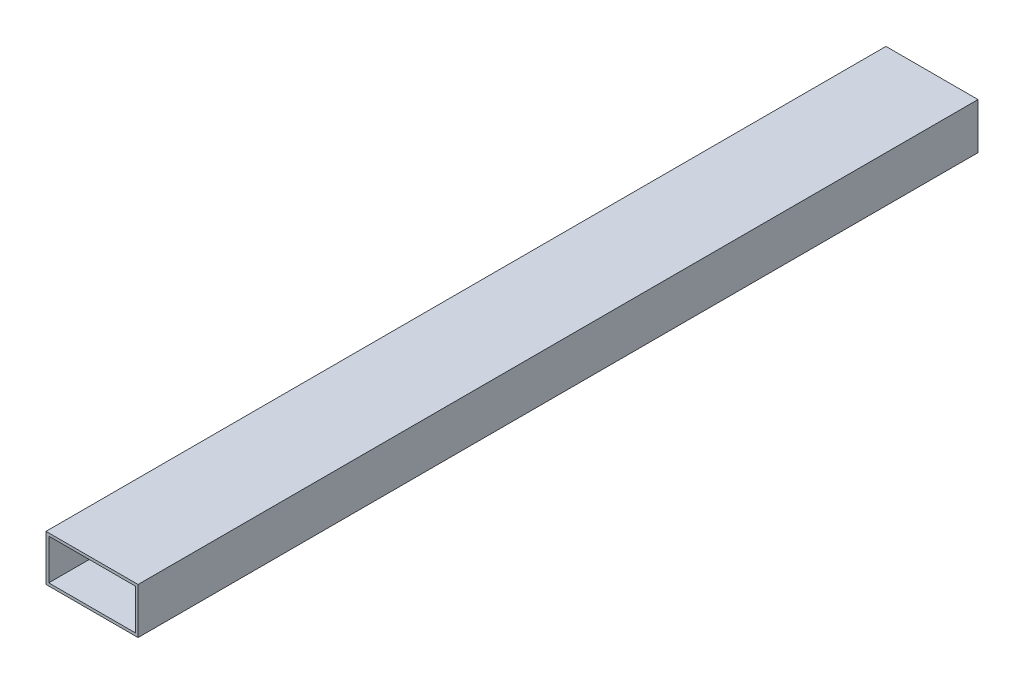
ISO-10303-21;
HEADER;
FILE_DESCRIPTION(('STEP AP214'),'2;1');
FILE_NAME('part.step','',(''),(''),'','','');
FILE_SCHEMA(('AUTOMOTIVE_DESIGN { 1 0 10303 214 1 1 1 1 }'));
ENDSEC;
DATA;
#1=APPLICATION_CONTEXT('core data for automotive mechanical design processes');
#2=APPLICATION_PROTOCOL_DEFINITION('international standard','automotive_design',2000,#1);
#3=PRODUCT_CONTEXT('',#1,'mechanical');
#4=PRODUCT('Part','Part','',(#3));
#5=PRODUCT_RELATED_PRODUCT_CATEGORY('part','',(#4));
#6=PRODUCT_DEFINITION_FORMATION('','',#4);
#7=PRODUCT_DEFINITION_CONTEXT('part definition',#1,'design');
#8=PRODUCT_DEFINITION('design','',#6,#7);
#9=PRODUCT_DEFINITION_SHAPE('','',#8);
#10=(LENGTH_UNIT() NAMED_UNIT(*) SI_UNIT(.MILLI.,.METRE.));
#11=(NAMED_UNIT(*) PLANE_ANGLE_UNIT() SI_UNIT($,.RADIAN.));
#12=(NAMED_UNIT(*) SI_UNIT($,.STERADIAN.) SOLID_ANGLE_UNIT());
#13=UNCERTAINTY_MEASURE_WITH_UNIT(LENGTH_MEASURE(1.E-05),#10,'distance_accuracy_value','');
#14=(GEOMETRIC_REPRESENTATION_CONTEXT(3) GLOBAL_UNCERTAINTY_ASSIGNED_CONTEXT((#13)) GLOBAL_UNIT_ASSIGNED_CONTEXT((#10,
#11,#12)) REPRESENTATION_CONTEXT('',''));
#15=CARTESIAN_POINT('',(0.,0.,0.));
#16=DIRECTION('',(0.,0.,1.));
#17=DIRECTION('',(1.,0.,0.));
#18=AXIS2_PLACEMENT_3D('',#15,#16,#17);
#19=CARTESIAN_POINT('',(0.,0.,463.55));
#20=DIRECTION('',(0.,0.,1.));
#21=DIRECTION('',(1.,0.,0.));
#22=AXIS2_PLACEMENT_3D('',#19,#20,#21);
#23=PLANE('',#22);
#24=DIRECTION('',(0.,1.,0.));
#25=VECTOR('',#24,1.);
#26=CARTESIAN_POINT('',(0.,0.,463.55));
#27=LINE('',#26,#25);
#28=CARTESIAN_POINT('',(0.,0.,463.55));
#29=VERTEX_POINT('',#28);
#30=CARTESIAN_POINT('',(0.,25.4,463.55));
#31=VERTEX_POINT('',#30);
#32=EDGE_CURVE('E177',#29,#31,#27,.T.);
#33=ORIENTED_EDGE('',*,*,#32,.T.);
#34=DIRECTION('',(-1.,0.,0.));
#35=VECTOR('',#34,1.);
#36=CARTESIAN_POINT('',(0.,25.4,463.55));
#37=LINE('',#36,#35);
#38=CARTESIAN_POINT('',(-50.8,25.4,463.55));
#39=VERTEX_POINT('',#38);
#40=EDGE_CURVE('E181',#31,#39,#37,.T.);
#41=ORIENTED_EDGE('',*,*,#40,.T.);
#42=DIRECTION('',(0.,-1.,0.));
#43=VECTOR('',#42,1.);
#44=CARTESIAN_POINT('',(-50.8,0.,463.55));
#45=LINE('',#44,#43);
#46=CARTESIAN_POINT('',(-50.8,0.,463.55));
#47=VERTEX_POINT('',#46);
#48=EDGE_CURVE('E185',#39,#47,#45,.T.);
#49=ORIENTED_EDGE('',*,*,#48,.T.);
#50=DIRECTION('',(1.,0.,0.));
#51=VECTOR('',#50,1.);
#52=CARTESIAN_POINT('',(0.,0.,463.55));
#53=LINE('',#52,#51);
#54=EDGE_CURVE('E188',#47,#29,#53,.T.);
#55=ORIENTED_EDGE('',*,*,#54,.T.);
#56=EDGE_LOOP('',(#33,#41,#49,#55));
#57=FACE_BOUND('',#56,.T.);
#58=DIRECTION('',(-1.,0.,0.));
#59=VECTOR('',#58,1.);
#60=CARTESIAN_POINT('',(0.,23.876,463.55));
#61=LINE('',#60,#59);
#62=CARTESIAN_POINT('',(-1.524,23.876,463.55));
#63=VERTEX_POINT('',#62);
#64=CARTESIAN_POINT('',(-49.276,23.876,463.55));
#65=VERTEX_POINT('',#64);
#66=EDGE_CURVE('E138',#63,#65,#61,.T.);
#67=ORIENTED_EDGE('',*,*,#66,.F.);
#68=DIRECTION('',(0.,1.,0.));
#69=VECTOR('',#68,1.);
#70=CARTESIAN_POINT('',(-1.524,0.,463.55));
#71=LINE('',#70,#69);
#72=CARTESIAN_POINT('',(-1.524,1.524,463.55));
#73=VERTEX_POINT('',#72);
#74=EDGE_CURVE('E129',#73,#63,#71,.T.);
#75=ORIENTED_EDGE('',*,*,#74,.F.);
#76=DIRECTION('',(1.,0.,0.));
#77=VECTOR('',#76,1.);
#78=CARTESIAN_POINT('',(0.,1.524,463.55));
#79=LINE('',#78,#77);
#80=CARTESIAN_POINT('',(-49.276,1.524,463.55));
#81=VERTEX_POINT('',#80);
#82=EDGE_CURVE('E155',#81,#73,#79,.T.);
#83=ORIENTED_EDGE('',*,*,#82,.F.);
#84=DIRECTION('',(0.,-1.,0.));
#85=VECTOR('',#84,1.);
#86=CARTESIAN_POINT('',(-49.276,0.,463.55));
#87=LINE('',#86,#85);
#88=EDGE_CURVE('E151',#65,#81,#87,.T.);
#89=ORIENTED_EDGE('',*,*,#88,.F.);
#90=EDGE_LOOP('',(#67,#75,#83,#89));
#91=FACE_BOUND('',#90,.T.);
#92=ADVANCED_FACE('F63',(#57,#91),#23,.T.);
#93=CARTESIAN_POINT('',(0.,0.,0.));
#94=DIRECTION('',(0.,0.,1.));
#95=DIRECTION('',(1.,0.,0.));
#96=AXIS2_PLACEMENT_3D('',#93,#94,#95);
#97=PLANE('',#96);
#98=DIRECTION('',(0.,1.,0.));
#99=VECTOR('',#98,1.);
#100=CARTESIAN_POINT('',(0.,0.,0.));
#101=LINE('',#100,#99);
#102=CARTESIAN_POINT('',(0.,0.,0.));
#103=VERTEX_POINT('',#102);
#104=CARTESIAN_POINT('',(0.,25.4,0.));
#105=VERTEX_POINT('',#104);
#106=EDGE_CURVE('E147',#103,#105,#101,.T.);
#107=ORIENTED_EDGE('',*,*,#106,.F.);
#108=DIRECTION('',(1.,0.,0.));
#109=VECTOR('',#108,1.);
#110=CARTESIAN_POINT('',(0.,0.,0.));
#111=LINE('',#110,#109);
#112=CARTESIAN_POINT('',(-50.8,0.,0.));
#113=VERTEX_POINT('',#112);
#114=EDGE_CURVE('E182',#113,#103,#111,.T.);
#115=ORIENTED_EDGE('',*,*,#114,.F.);
#116=DIRECTION('',(0.,-1.,0.));
#117=VECTOR('',#116,1.);
#118=CARTESIAN_POINT('',(-50.8,0.,0.));
#119=LINE('',#118,#117);
#120=CARTESIAN_POINT('',(-50.8,25.4,0.));
#121=VERTEX_POINT('',#120);
#122=EDGE_CURVE('E198',#121,#113,#119,.T.);
#123=ORIENTED_EDGE('',*,*,#122,.F.);
#124=DIRECTION('',(-1.,0.,0.));
#125=VECTOR('',#124,1.);
#126=CARTESIAN_POINT('',(0.,25.4,0.));
#127=LINE('',#126,#125);
#128=EDGE_CURVE('E195',#105,#121,#127,.T.);
#129=ORIENTED_EDGE('',*,*,#128,.F.);
#130=EDGE_LOOP('',(#107,#115,#123,#129));
#131=FACE_BOUND('',#130,.T.);
#132=DIRECTION('',(0.,1.,0.));
#133=VECTOR('',#132,1.);
#134=CARTESIAN_POINT('',(-1.524,0.,0.));
#135=LINE('',#134,#133);
#136=CARTESIAN_POINT('',(-1.524,1.524,0.));
#137=VERTEX_POINT('',#136);
#138=CARTESIAN_POINT('',(-1.524,23.876,0.));
#139=VERTEX_POINT('',#138);
#140=EDGE_CURVE('E87',#137,#139,#135,.T.);
#141=ORIENTED_EDGE('',*,*,#140,.T.);
#142=DIRECTION('',(-1.,0.,0.));
#143=VECTOR('',#142,1.);
#144=CARTESIAN_POINT('',(0.,23.876,0.));
#145=LINE('',#144,#143);
#146=CARTESIAN_POINT('',(-49.276,23.876,0.));
#147=VERTEX_POINT('',#146);
#148=EDGE_CURVE('E145',#139,#147,#145,.T.);
#149=ORIENTED_EDGE('',*,*,#148,.T.);
#150=DIRECTION('',(0.,-1.,0.));
#151=VECTOR('',#150,1.);
#152=CARTESIAN_POINT('',(-49.276,0.,0.));
#153=LINE('',#152,#151);
#154=CARTESIAN_POINT('',(-49.276,1.524,0.));
#155=VERTEX_POINT('',#154);
#156=EDGE_CURVE('E164',#147,#155,#153,.T.);
#157=ORIENTED_EDGE('',*,*,#156,.T.);
#158=DIRECTION('',(1.,0.,0.));
#159=VECTOR('',#158,1.);
#160=CARTESIAN_POINT('',(0.,1.524,0.));
#161=LINE('',#160,#159);
#162=EDGE_CURVE('E139',#155,#137,#161,.T.);
#163=ORIENTED_EDGE('',*,*,#162,.T.);
#164=EDGE_LOOP('',(#141,#149,#157,#163));
#165=FACE_BOUND('',#164,.T.);
#166=ADVANCED_FACE('F221',(#131,#165),#97,.F.);
#167=CARTESIAN_POINT('',(0.,0.,463.55));
#168=DIRECTION('',(-1.,0.,0.));
#169=DIRECTION('',(0.,-1.,0.));
#170=AXIS2_PLACEMENT_3D('',#167,#168,#169);
#171=PLANE('',#170);
#172=ORIENTED_EDGE('',*,*,#106,.T.);
#173=DIRECTION('',(0.,0.,-1.));
#174=VECTOR('',#173,1.);
#175=CARTESIAN_POINT('',(0.,25.4,463.55));
#176=LINE('',#175,#174);
#177=EDGE_CURVE('E12',#31,#105,#176,.T.);
#178=ORIENTED_EDGE('',*,*,#177,.F.);
#179=ORIENTED_EDGE('',*,*,#32,.F.);
#180=DIRECTION('',(0.,0.,-1.));
#181=VECTOR('',#180,1.);
#182=CARTESIAN_POINT('',(0.,0.,463.55));
#183=LINE('',#182,#181);
#184=EDGE_CURVE('E191',#29,#103,#183,.T.);
#185=ORIENTED_EDGE('',*,*,#184,.T.);
#186=EDGE_LOOP('',(#172,#178,#179,#185));
#187=FACE_BOUND('',#186,.T.);
#188=ADVANCED_FACE('F65',(#187),#171,.F.);
#189=CARTESIAN_POINT('',(0.,25.4,463.55));
#190=DIRECTION('',(0.,-1.,0.));
#191=DIRECTION('',(1.,0.,0.));
#192=AXIS2_PLACEMENT_3D('',#189,#190,#191);
#193=PLANE('',#192);
#194=ORIENTED_EDGE('',*,*,#128,.T.);
#195=DIRECTION('',(0.,0.,-1.));
#196=VECTOR('',#195,1.);
#197=CARTESIAN_POINT('',(-50.8,25.4,463.55));
#198=LINE('',#197,#196);
#199=EDGE_CURVE('E72',#39,#121,#198,.T.);
#200=ORIENTED_EDGE('',*,*,#199,.F.);
#201=ORIENTED_EDGE('',*,*,#40,.F.);
#202=ORIENTED_EDGE('',*,*,#177,.T.);
#203=EDGE_LOOP('',(#194,#200,#201,#202));
#204=FACE_BOUND('',#203,.T.);
#205=ADVANCED_FACE('F231',(#204),#193,.F.);
#206=CARTESIAN_POINT('',(-50.8,0.,463.55));
#207=DIRECTION('',(1.,0.,0.));
#208=DIRECTION('',(0.,0.,-1.));
#209=AXIS2_PLACEMENT_3D('',#206,#207,#208);
#210=PLANE('',#209);
#211=ORIENTED_EDGE('',*,*,#122,.T.);
#212=DIRECTION('',(0.,0.,-1.));
#213=VECTOR('',#212,1.);
#214=CARTESIAN_POINT('',(-50.8,0.,463.55));
#215=LINE('',#214,#213);
#216=EDGE_CURVE('E206',#47,#113,#215,.T.);
#217=ORIENTED_EDGE('',*,*,#216,.F.);
#218=ORIENTED_EDGE('',*,*,#48,.F.);
#219=ORIENTED_EDGE('',*,*,#199,.T.);
#220=EDGE_LOOP('',(#211,#217,#218,#219));
#221=FACE_BOUND('',#220,.T.);
#222=ADVANCED_FACE('F215',(#221),#210,.F.);
#223=CARTESIAN_POINT('',(0.,0.,463.55));
#224=DIRECTION('',(0.,1.,0.));
#225=DIRECTION('',(0.,0.,1.));
#226=AXIS2_PLACEMENT_3D('',#223,#224,#225);
#227=PLANE('',#226);
#228=ORIENTED_EDGE('',*,*,#114,.T.);
#229=ORIENTED_EDGE('',*,*,#184,.F.);
#230=ORIENTED_EDGE('',*,*,#54,.F.);
#231=ORIENTED_EDGE('',*,*,#216,.T.);
#232=EDGE_LOOP('',(#228,#229,#230,#231));
#233=FACE_BOUND('',#232,.T.);
#234=ADVANCED_FACE('F225',(#233),#227,.F.);
#235=CARTESIAN_POINT('',(-1.524,0.,463.55));
#236=DIRECTION('',(-1.,0.,0.));
#237=DIRECTION('',(0.,-1.,0.));
#238=AXIS2_PLACEMENT_3D('',#235,#236,#237);
#239=PLANE('',#238);
#240=ORIENTED_EDGE('',*,*,#140,.F.);
#241=DIRECTION('',(0.,0.,-1.));
#242=VECTOR('',#241,1.);
#243=CARTESIAN_POINT('',(-1.524,1.524,463.55));
#244=LINE('',#243,#242);
#245=EDGE_CURVE('E133',#73,#137,#244,.T.);
#246=ORIENTED_EDGE('',*,*,#245,.F.);
#247=ORIENTED_EDGE('',*,*,#74,.T.);
#248=DIRECTION('',(0.,0.,-1.));
#249=VECTOR('',#248,1.);
#250=CARTESIAN_POINT('',(-1.524,23.876,463.55));
#251=LINE('',#250,#249);
#252=EDGE_CURVE('E132',#63,#139,#251,.T.);
#253=ORIENTED_EDGE('',*,*,#252,.T.);
#254=EDGE_LOOP('',(#240,#246,#247,#253));
#255=FACE_BOUND('',#254,.T.);
#256=ADVANCED_FACE('F131',(#255),#239,.T.);
#257=CARTESIAN_POINT('',(0.,23.876,463.55));
#258=DIRECTION('',(0.,-1.,0.));
#259=DIRECTION('',(1.,0.,0.));
#260=AXIS2_PLACEMENT_3D('',#257,#258,#259);
#261=PLANE('',#260);
#262=ORIENTED_EDGE('',*,*,#148,.F.);
#263=ORIENTED_EDGE('',*,*,#252,.F.);
#264=ORIENTED_EDGE('',*,*,#66,.T.);
#265=DIRECTION('',(0.,0.,-1.));
#266=VECTOR('',#265,1.);
#267=CARTESIAN_POINT('',(-49.276,23.876,463.55));
#268=LINE('',#267,#266);
#269=EDGE_CURVE('E148',#65,#147,#268,.T.);
#270=ORIENTED_EDGE('',*,*,#269,.T.);
#271=EDGE_LOOP('',(#262,#263,#264,#270));
#272=FACE_BOUND('',#271,.T.);
#273=ADVANCED_FACE('F142',(#272),#261,.T.);
#274=CARTESIAN_POINT('',(-49.276,0.,463.55));
#275=DIRECTION('',(1.,0.,0.));
#276=DIRECTION('',(0.,0.,-1.));
#277=AXIS2_PLACEMENT_3D('',#274,#275,#276);
#278=PLANE('',#277);
#279=ORIENTED_EDGE('',*,*,#156,.F.);
#280=ORIENTED_EDGE('',*,*,#269,.F.);
#281=ORIENTED_EDGE('',*,*,#88,.T.);
#282=DIRECTION('',(0.,0.,-1.));
#283=VECTOR('',#282,1.);
#284=CARTESIAN_POINT('',(-49.276,1.524,463.55));
#285=LINE('',#284,#283);
#286=EDGE_CURVE('E79',#81,#155,#285,.T.);
#287=ORIENTED_EDGE('',*,*,#286,.T.);
#288=EDGE_LOOP('',(#279,#280,#281,#287));
#289=FACE_BOUND('',#288,.T.);
#290=ADVANCED_FACE('F254',(#289),#278,.T.);
#291=CARTESIAN_POINT('',(0.,1.524,463.55));
#292=DIRECTION('',(0.,1.,0.));
#293=DIRECTION('',(0.,0.,1.));
#294=AXIS2_PLACEMENT_3D('',#291,#292,#293);
#295=PLANE('',#294);
#296=ORIENTED_EDGE('',*,*,#162,.F.);
#297=ORIENTED_EDGE('',*,*,#286,.F.);
#298=ORIENTED_EDGE('',*,*,#82,.T.);
#299=ORIENTED_EDGE('',*,*,#245,.T.);
#300=EDGE_LOOP('',(#296,#297,#298,#299));
#301=FACE_BOUND('',#300,.T.);
#302=ADVANCED_FACE('F258',(#301),#295,.T.);
#303=CLOSED_SHELL('',(#92,#166,#188,#205,#222,#234,#256,#273,#290,#302));
#304=MANIFOLD_SOLID_BREP('B2',#303);
#305=ADVANCED_BREP_SHAPE_REPRESENTATION('',(#18,#304),#14);
#306=SHAPE_DEFINITION_REPRESENTATION(#9,#305);
ENDSEC;
END-ISO-10303-21;
